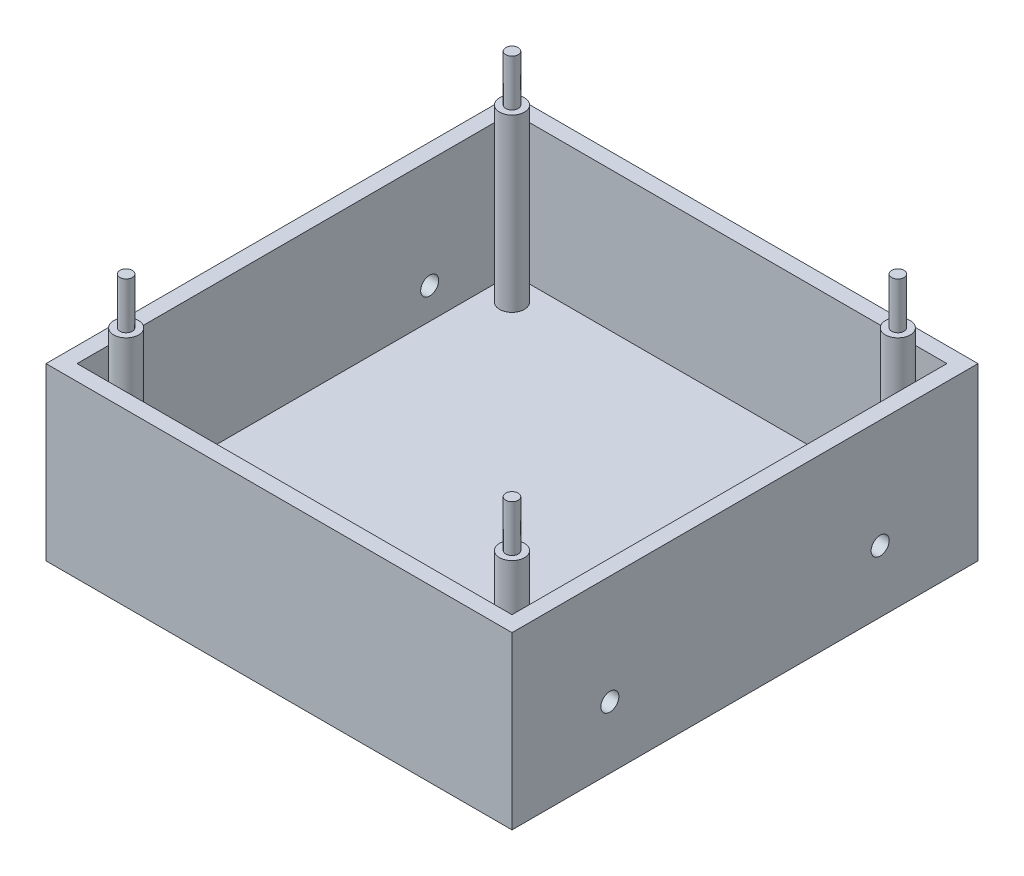
ISO-10303-21;
HEADER;
FILE_DESCRIPTION(('STEP AP214'),'2;1');
FILE_NAME('part.step','',(''),(''),'','','');
FILE_SCHEMA(('AUTOMOTIVE_DESIGN { 1 0 10303 214 1 1 1 1 }'));
ENDSEC;
DATA;
#1=APPLICATION_CONTEXT('core data for automotive mechanical design processes');
#2=APPLICATION_PROTOCOL_DEFINITION('international standard','automotive_design',2000,#1);
#3=PRODUCT_CONTEXT('',#1,'mechanical');
#4=PRODUCT('Part','Part','',(#3));
#5=PRODUCT_RELATED_PRODUCT_CATEGORY('part','',(#4));
#6=PRODUCT_DEFINITION_FORMATION('','',#4);
#7=PRODUCT_DEFINITION_CONTEXT('part definition',#1,'design');
#8=PRODUCT_DEFINITION('design','',#6,#7);
#9=PRODUCT_DEFINITION_SHAPE('','',#8);
#10=(LENGTH_UNIT() NAMED_UNIT(*) SI_UNIT(.MILLI.,.METRE.));
#11=(NAMED_UNIT(*) PLANE_ANGLE_UNIT() SI_UNIT($,.RADIAN.));
#12=(NAMED_UNIT(*) SI_UNIT($,.STERADIAN.) SOLID_ANGLE_UNIT());
#13=UNCERTAINTY_MEASURE_WITH_UNIT(LENGTH_MEASURE(1.E-05),#10,'distance_accuracy_value','');
#14=(GEOMETRIC_REPRESENTATION_CONTEXT(3) GLOBAL_UNCERTAINTY_ASSIGNED_CONTEXT((#13)) GLOBAL_UNIT_ASSIGNED_CONTEXT((#10,
#11,#12)) REPRESENTATION_CONTEXT('',''));
#15=CARTESIAN_POINT('',(0.,0.,0.));
#16=DIRECTION('',(0.,0.,1.));
#17=DIRECTION('',(1.,0.,0.));
#18=AXIS2_PLACEMENT_3D('',#15,#16,#17);
#19=CARTESIAN_POINT('',(0.,55.,4.99999999999999));
#20=DIRECTION('',(0.,0.,-1.));
#21=DIRECTION('',(-1.,0.,0.));
#22=AXIS2_PLACEMENT_3D('',#19,#20,#21);
#23=PLANE('',#22);
#24=DIRECTION('',(0.,-1.,0.));
#25=VECTOR('',#24,1.);
#26=CARTESIAN_POINT('',(4.99999999999998,55.,4.99999999999999));
#27=LINE('',#26,#25);
#28=CARTESIAN_POINT('',(4.99999999999998,55.,4.99999999999999));
#29=VERTEX_POINT('',#28);
#30=CARTESIAN_POINT('',(4.99999999999998,10.,4.99999999999999));
#31=VERTEX_POINT('',#30);
#32=EDGE_CURVE('E113',#29,#31,#27,.T.);
#33=ORIENTED_EDGE('',*,*,#32,.T.);
#34=DIRECTION('',(1.,0.,0.));
#35=VECTOR('',#34,1.);
#36=CARTESIAN_POINT('',(0.,10.,4.99999999999999));
#37=LINE('',#36,#35);
#38=CARTESIAN_POINT('',(145.,10.,4.99999999999999));
#39=VERTEX_POINT('',#38);
#40=EDGE_CURVE('E52',#31,#39,#37,.T.);
#41=ORIENTED_EDGE('',*,*,#40,.T.);
#42=DIRECTION('',(0.,-1.,0.));
#43=VECTOR('',#42,1.);
#44=CARTESIAN_POINT('',(145.,55.,4.99999999999999));
#45=LINE('',#44,#43);
#46=CARTESIAN_POINT('',(145.,55.,4.99999999999999));
#47=VERTEX_POINT('',#46);
#48=EDGE_CURVE('E11',#47,#39,#45,.T.);
#49=ORIENTED_EDGE('',*,*,#48,.F.);
#50=DIRECTION('',(1.,0.,0.));
#51=VECTOR('',#50,1.);
#52=CARTESIAN_POINT('',(0.,55.,4.99999999999999));
#53=LINE('',#52,#51);
#54=EDGE_CURVE('E137',#29,#47,#53,.T.);
#55=ORIENTED_EDGE('',*,*,#54,.F.);
#56=EDGE_LOOP('',(#33,#41,#49,#55));
#57=FACE_BOUND('',#56,.T.);
#58=ADVANCED_FACE('F35',(#57),#23,.F.);
#59=CARTESIAN_POINT('',(145.,55.,0.));
#60=DIRECTION('',(1.,0.,0.));
#61=DIRECTION('',(0.,0.,-1.));
#62=AXIS2_PLACEMENT_3D('',#59,#60,#61);
#63=PLANE('',#62);
#64=CARTESIAN_POINT('',(145.,20.,31.5));
#65=DIRECTION('',(1.,0.,0.));
#66=DIRECTION('',(0.,0.,-1.));
#67=AXIS2_PLACEMENT_3D('',#64,#65,#66);
#68=CIRCLE('',#67,2.9);
#69=CARTESIAN_POINT('',(145.,20.,28.6));
#70=VERTEX_POINT('',#69);
#71=EDGE_CURVE('E186',#70,#70,#68,.F.);
#72=ORIENTED_EDGE('',*,*,#71,.F.);
#73=EDGE_LOOP('',(#72));
#74=FACE_BOUND('',#73,.T.);
#75=CARTESIAN_POINT('',(145.,20.,118.5));
#76=DIRECTION('',(1.,0.,0.));
#77=DIRECTION('',(0.,0.,-1.));
#78=AXIS2_PLACEMENT_3D('',#75,#76,#77);
#79=CIRCLE('',#78,2.9);
#80=CARTESIAN_POINT('',(145.,20.,115.6));
#81=VERTEX_POINT('',#80);
#82=EDGE_CURVE('E171',#81,#81,#79,.F.);
#83=ORIENTED_EDGE('',*,*,#82,.F.);
#84=EDGE_LOOP('',(#83));
#85=FACE_BOUND('',#84,.T.);
#86=ORIENTED_EDGE('',*,*,#48,.T.);
#87=DIRECTION('',(0.,0.,1.));
#88=VECTOR('',#87,1.);
#89=CARTESIAN_POINT('',(145.,10.,0.));
#90=LINE('',#89,#88);
#91=CARTESIAN_POINT('',(145.,10.,145.));
#92=VERTEX_POINT('',#91);
#93=EDGE_CURVE('E58',#39,#92,#90,.T.);
#94=ORIENTED_EDGE('',*,*,#93,.T.);
#95=DIRECTION('',(0.,-1.,0.));
#96=VECTOR('',#95,1.);
#97=CARTESIAN_POINT('',(145.,55.,145.));
#98=LINE('',#97,#96);
#99=CARTESIAN_POINT('',(145.,55.,145.));
#100=VERTEX_POINT('',#99);
#101=EDGE_CURVE('E44',#100,#92,#98,.T.);
#102=ORIENTED_EDGE('',*,*,#101,.F.);
#103=DIRECTION('',(0.,0.,1.));
#104=VECTOR('',#103,1.);
#105=CARTESIAN_POINT('',(145.,55.,0.));
#106=LINE('',#105,#104);
#107=EDGE_CURVE('E140',#47,#100,#106,.T.);
#108=ORIENTED_EDGE('',*,*,#107,.F.);
#109=EDGE_LOOP('',(#86,#94,#102,#108));
#110=FACE_BOUND('',#109,.T.);
#111=ADVANCED_FACE('F258',(#74,#85,#110),#63,.F.);
#112=CARTESIAN_POINT('',(0.,55.,145.));
#113=DIRECTION('',(0.,0.,-1.));
#114=DIRECTION('',(-1.,0.,0.));
#115=AXIS2_PLACEMENT_3D('',#112,#113,#114);
#116=PLANE('',#115);
#117=DIRECTION('',(1.,0.,0.));
#118=VECTOR('',#117,1.);
#119=CARTESIAN_POINT('',(0.,10.,145.));
#120=LINE('',#119,#118);
#121=CARTESIAN_POINT('',(4.99999999999999,10.,145.));
#122=VERTEX_POINT('',#121);
#123=EDGE_CURVE('E116',#122,#92,#120,.T.);
#124=ORIENTED_EDGE('',*,*,#123,.F.);
#125=DIRECTION('',(0.,-1.,0.));
#126=VECTOR('',#125,1.);
#127=CARTESIAN_POINT('',(4.99999999999999,55.,145.));
#128=LINE('',#127,#126);
#129=CARTESIAN_POINT('',(4.99999999999999,55.,145.));
#130=VERTEX_POINT('',#129);
#131=EDGE_CURVE('E103',#130,#122,#128,.T.);
#132=ORIENTED_EDGE('',*,*,#131,.F.);
#133=DIRECTION('',(1.,0.,0.));
#134=VECTOR('',#133,1.);
#135=CARTESIAN_POINT('',(0.,55.,145.));
#136=LINE('',#135,#134);
#137=EDGE_CURVE('E142',#130,#100,#136,.T.);
#138=ORIENTED_EDGE('',*,*,#137,.T.);
#139=ORIENTED_EDGE('',*,*,#101,.T.);
#140=EDGE_LOOP('',(#124,#132,#138,#139));
#141=FACE_BOUND('',#140,.T.);
#142=ADVANCED_FACE('F117',(#141),#116,.T.);
#143=CARTESIAN_POINT('',(150.,55.,0.));
#144=DIRECTION('',(1.,0.,0.));
#145=DIRECTION('',(0.,0.,-1.));
#146=AXIS2_PLACEMENT_3D('',#143,#144,#145);
#147=PLANE('',#146);
#148=CARTESIAN_POINT('',(150.,20.,31.5));
#149=DIRECTION('',(1.,0.,0.));
#150=DIRECTION('',(0.,0.,-1.));
#151=AXIS2_PLACEMENT_3D('',#148,#149,#150);
#152=CIRCLE('',#151,2.9);
#153=CARTESIAN_POINT('',(150.,20.,28.6));
#154=VERTEX_POINT('',#153);
#155=EDGE_CURVE('E167',#154,#154,#152,.T.);
#156=ORIENTED_EDGE('',*,*,#155,.F.);
#157=EDGE_LOOP('',(#156));
#158=FACE_BOUND('',#157,.T.);
#159=CARTESIAN_POINT('',(150.,20.,118.5));
#160=DIRECTION('',(1.,0.,0.));
#161=DIRECTION('',(0.,0.,-1.));
#162=AXIS2_PLACEMENT_3D('',#159,#160,#161);
#163=CIRCLE('',#162,2.9);
#164=CARTESIAN_POINT('',(150.,20.,115.6));
#165=VERTEX_POINT('',#164);
#166=EDGE_CURVE('E174',#165,#165,#163,.T.);
#167=ORIENTED_EDGE('',*,*,#166,.F.);
#168=EDGE_LOOP('',(#167));
#169=FACE_BOUND('',#168,.T.);
#170=DIRECTION('',(0.,0.,1.));
#171=VECTOR('',#170,1.);
#172=CARTESIAN_POINT('',(150.,0.,0.));
#173=LINE('',#172,#171);
#174=CARTESIAN_POINT('',(150.,0.,0.));
#175=VERTEX_POINT('',#174);
#176=CARTESIAN_POINT('',(150.,0.,150.));
#177=VERTEX_POINT('',#176);
#178=EDGE_CURVE('E119',#175,#177,#173,.T.);
#179=ORIENTED_EDGE('',*,*,#178,.F.);
#180=DIRECTION('',(0.,-1.,0.));
#181=VECTOR('',#180,1.);
#182=CARTESIAN_POINT('',(150.,55.,0.));
#183=LINE('',#182,#181);
#184=CARTESIAN_POINT('',(150.,55.,0.));
#185=VERTEX_POINT('',#184);
#186=EDGE_CURVE('E155',#185,#175,#183,.T.);
#187=ORIENTED_EDGE('',*,*,#186,.F.);
#188=DIRECTION('',(0.,0.,1.));
#189=VECTOR('',#188,1.);
#190=CARTESIAN_POINT('',(150.,55.,0.));
#191=LINE('',#190,#189);
#192=CARTESIAN_POINT('',(150.,55.,150.));
#193=VERTEX_POINT('',#192);
#194=EDGE_CURVE('E126',#185,#193,#191,.T.);
#195=ORIENTED_EDGE('',*,*,#194,.T.);
#196=DIRECTION('',(0.,-1.,0.));
#197=VECTOR('',#196,1.);
#198=CARTESIAN_POINT('',(150.,55.,150.));
#199=LINE('',#198,#197);
#200=EDGE_CURVE('E145',#193,#177,#199,.T.);
#201=ORIENTED_EDGE('',*,*,#200,.T.);
#202=EDGE_LOOP('',(#179,#187,#195,#201));
#203=FACE_BOUND('',#202,.T.);
#204=ADVANCED_FACE('F37',(#158,#169,#203),#147,.T.);
#205=CARTESIAN_POINT('',(0.,55.,0.));
#206=DIRECTION('',(0.,0.,-1.));
#207=DIRECTION('',(-1.,0.,0.));
#208=AXIS2_PLACEMENT_3D('',#205,#206,#207);
#209=PLANE('',#208);
#210=DIRECTION('',(1.,0.,0.));
#211=VECTOR('',#210,1.);
#212=CARTESIAN_POINT('',(0.,0.,0.));
#213=LINE('',#212,#211);
#214=CARTESIAN_POINT('',(0.,0.,0.));
#215=VERTEX_POINT('',#214);
#216=EDGE_CURVE('E148',#215,#175,#213,.T.);
#217=ORIENTED_EDGE('',*,*,#216,.F.);
#218=DIRECTION('',(0.,-1.,0.));
#219=VECTOR('',#218,1.);
#220=CARTESIAN_POINT('',(0.,55.,0.));
#221=LINE('',#220,#219);
#222=CARTESIAN_POINT('',(0.,55.,0.));
#223=VERTEX_POINT('',#222);
#224=EDGE_CURVE('E162',#223,#215,#221,.T.);
#225=ORIENTED_EDGE('',*,*,#224,.F.);
#226=DIRECTION('',(1.,0.,0.));
#227=VECTOR('',#226,1.);
#228=CARTESIAN_POINT('',(0.,55.,0.));
#229=LINE('',#228,#227);
#230=EDGE_CURVE('E129',#223,#185,#229,.T.);
#231=ORIENTED_EDGE('',*,*,#230,.T.);
#232=ORIENTED_EDGE('',*,*,#186,.T.);
#233=EDGE_LOOP('',(#217,#225,#231,#232));
#234=FACE_BOUND('',#233,.T.);
#235=ADVANCED_FACE('F273',(#234),#209,.T.);
#236=CARTESIAN_POINT('',(0.,55.,0.));
#237=DIRECTION('',(1.,0.,0.));
#238=DIRECTION('',(0.,0.,-1.));
#239=AXIS2_PLACEMENT_3D('',#236,#237,#238);
#240=PLANE('',#239);
#241=CARTESIAN_POINT('',(0.,20.,31.5));
#242=DIRECTION('',(1.,0.,0.));
#243=DIRECTION('',(0.,0.,-1.));
#244=AXIS2_PLACEMENT_3D('',#241,#242,#243);
#245=CIRCLE('',#244,2.9);
#246=CARTESIAN_POINT('',(0.,20.,28.6));
#247=VERTEX_POINT('',#246);
#248=EDGE_CURVE('E183',#247,#247,#245,.F.);
#249=ORIENTED_EDGE('',*,*,#248,.F.);
#250=EDGE_LOOP('',(#249));
#251=FACE_BOUND('',#250,.T.);
#252=CARTESIAN_POINT('',(0.,20.,118.5));
#253=DIRECTION('',(1.,0.,0.));
#254=DIRECTION('',(0.,0.,-1.));
#255=AXIS2_PLACEMENT_3D('',#252,#253,#254);
#256=CIRCLE('',#255,2.9);
#257=CARTESIAN_POINT('',(0.,20.,115.6));
#258=VERTEX_POINT('',#257);
#259=EDGE_CURVE('E166',#258,#258,#256,.F.);
#260=ORIENTED_EDGE('',*,*,#259,.F.);
#261=EDGE_LOOP('',(#260));
#262=FACE_BOUND('',#261,.T.);
#263=DIRECTION('',(0.,0.,1.));
#264=VECTOR('',#263,1.);
#265=CARTESIAN_POINT('',(0.,0.,0.));
#266=LINE('',#265,#264);
#267=CARTESIAN_POINT('',(0.,0.,150.));
#268=VERTEX_POINT('',#267);
#269=EDGE_CURVE('E151',#215,#268,#266,.T.);
#270=ORIENTED_EDGE('',*,*,#269,.T.);
#271=DIRECTION('',(0.,-1.,0.));
#272=VECTOR('',#271,1.);
#273=CARTESIAN_POINT('',(0.,55.,150.));
#274=LINE('',#273,#272);
#275=CARTESIAN_POINT('',(0.,55.,150.));
#276=VERTEX_POINT('',#275);
#277=EDGE_CURVE('E159',#276,#268,#274,.T.);
#278=ORIENTED_EDGE('',*,*,#277,.F.);
#279=DIRECTION('',(0.,0.,1.));
#280=VECTOR('',#279,1.);
#281=CARTESIAN_POINT('',(0.,55.,0.));
#282=LINE('',#281,#280);
#283=EDGE_CURVE('E133',#223,#276,#282,.T.);
#284=ORIENTED_EDGE('',*,*,#283,.F.);
#285=ORIENTED_EDGE('',*,*,#224,.T.);
#286=EDGE_LOOP('',(#270,#278,#284,#285));
#287=FACE_BOUND('',#286,.T.);
#288=ADVANCED_FACE('F270',(#251,#262,#287),#240,.F.);
#289=CARTESIAN_POINT('',(0.,55.,150.));
#290=DIRECTION('',(0.,0.,-1.));
#291=DIRECTION('',(-1.,0.,0.));
#292=AXIS2_PLACEMENT_3D('',#289,#290,#291);
#293=PLANE('',#292);
#294=DIRECTION('',(1.,0.,0.));
#295=VECTOR('',#294,1.);
#296=CARTESIAN_POINT('',(0.,0.,150.));
#297=LINE('',#296,#295);
#298=EDGE_CURVE('E130',#268,#177,#297,.T.);
#299=ORIENTED_EDGE('',*,*,#298,.T.);
#300=ORIENTED_EDGE('',*,*,#200,.F.);
#301=DIRECTION('',(1.,0.,0.));
#302=VECTOR('',#301,1.);
#303=CARTESIAN_POINT('',(0.,55.,150.));
#304=LINE('',#303,#302);
#305=EDGE_CURVE('E135',#276,#193,#304,.T.);
#306=ORIENTED_EDGE('',*,*,#305,.F.);
#307=ORIENTED_EDGE('',*,*,#277,.T.);
#308=EDGE_LOOP('',(#299,#300,#306,#307));
#309=FACE_BOUND('',#308,.T.);
#310=ADVANCED_FACE('F267',(#309),#293,.F.);
#311=CARTESIAN_POINT('',(4.99999999999998,55.,0.));
#312=DIRECTION('',(1.,0.,0.));
#313=DIRECTION('',(0.,0.,-1.));
#314=AXIS2_PLACEMENT_3D('',#311,#312,#313);
#315=PLANE('',#314);
#316=CARTESIAN_POINT('',(4.99999999999998,20.,31.5));
#317=DIRECTION('',(1.,0.,0.));
#318=DIRECTION('',(0.,0.,-1.));
#319=AXIS2_PLACEMENT_3D('',#316,#317,#318);
#320=CIRCLE('',#319,2.9);
#321=CARTESIAN_POINT('',(4.99999999999998,20.,28.6));
#322=VERTEX_POINT('',#321);
#323=EDGE_CURVE('E39',#322,#322,#320,.F.);
#324=ORIENTED_EDGE('',*,*,#323,.T.);
#325=EDGE_LOOP('',(#324));
#326=FACE_BOUND('',#325,.T.);
#327=CARTESIAN_POINT('',(5.,20.,118.5));
#328=DIRECTION('',(1.,0.,0.));
#329=DIRECTION('',(0.,0.,-1.));
#330=AXIS2_PLACEMENT_3D('',#327,#328,#329);
#331=CIRCLE('',#330,2.9);
#332=CARTESIAN_POINT('',(5.,20.,115.6));
#333=VERTEX_POINT('',#332);
#334=EDGE_CURVE('E164',#333,#333,#331,.F.);
#335=ORIENTED_EDGE('',*,*,#334,.T.);
#336=EDGE_LOOP('',(#335));
#337=FACE_BOUND('',#336,.T.);
#338=DIRECTION('',(0.,0.,1.));
#339=VECTOR('',#338,1.);
#340=CARTESIAN_POINT('',(4.99999999999998,10.,0.));
#341=LINE('',#340,#339);
#342=EDGE_CURVE('E107',#31,#122,#341,.T.);
#343=ORIENTED_EDGE('',*,*,#342,.F.);
#344=ORIENTED_EDGE('',*,*,#32,.F.);
#345=DIRECTION('',(0.,0.,1.));
#346=VECTOR('',#345,1.);
#347=CARTESIAN_POINT('',(4.99999999999998,55.,0.));
#348=LINE('',#347,#346);
#349=EDGE_CURVE('E109',#29,#130,#348,.T.);
#350=ORIENTED_EDGE('',*,*,#349,.T.);
#351=ORIENTED_EDGE('',*,*,#131,.T.);
#352=EDGE_LOOP('',(#343,#344,#350,#351));
#353=FACE_BOUND('',#352,.T.);
#354=ADVANCED_FACE('F105',(#326,#337,#353),#315,.T.);
#355=CARTESIAN_POINT('',(0.,55.,0.));
#356=DIRECTION('',(0.,1.,0.));
#357=DIRECTION('',(0.,0.,1.));
#358=AXIS2_PLACEMENT_3D('',#355,#356,#357);
#359=PLANE('',#358);
#360=ORIENTED_EDGE('',*,*,#194,.F.);
#361=ORIENTED_EDGE('',*,*,#230,.F.);
#362=ORIENTED_EDGE('',*,*,#283,.T.);
#363=ORIENTED_EDGE('',*,*,#305,.T.);
#364=EDGE_LOOP('',(#360,#361,#362,#363));
#365=FACE_BOUND('',#364,.T.);
#366=ORIENTED_EDGE('',*,*,#54,.T.);
#367=ORIENTED_EDGE('',*,*,#107,.T.);
#368=ORIENTED_EDGE('',*,*,#137,.F.);
#369=ORIENTED_EDGE('',*,*,#349,.F.);
#370=EDGE_LOOP('',(#366,#367,#368,#369));
#371=FACE_BOUND('',#370,.T.);
#372=ADVANCED_FACE('F251',(#365,#371),#359,.T.);
#373=CARTESIAN_POINT('',(0.,0.,0.));
#374=DIRECTION('',(0.,1.,0.));
#375=DIRECTION('',(0.,0.,1.));
#376=AXIS2_PLACEMENT_3D('',#373,#374,#375);
#377=PLANE('',#376);
#378=ORIENTED_EDGE('',*,*,#178,.T.);
#379=ORIENTED_EDGE('',*,*,#298,.F.);
#380=ORIENTED_EDGE('',*,*,#269,.F.);
#381=ORIENTED_EDGE('',*,*,#216,.T.);
#382=EDGE_LOOP('',(#378,#379,#380,#381));
#383=FACE_BOUND('',#382,.T.);
#384=ADVANCED_FACE('F242',(#383),#377,.F.);
#385=CARTESIAN_POINT('',(0.,10.,0.));
#386=DIRECTION('',(0.,1.,0.));
#387=DIRECTION('',(0.,0.,1.));
#388=AXIS2_PLACEMENT_3D('',#385,#386,#387);
#389=PLANE('',#388);
#390=CARTESIAN_POINT('',(12.9,10.,137.1));
#391=DIRECTION('',(0.,1.,0.));
#392=DIRECTION('',(0.,0.,1.));
#393=AXIS2_PLACEMENT_3D('',#390,#391,#392);
#394=CIRCLE('',#393,4.00000000000036);
#395=CARTESIAN_POINT('',(12.9,10.,141.1));
#396=VERTEX_POINT('',#395);
#397=EDGE_CURVE('E225',#396,#396,#394,.T.);
#398=ORIENTED_EDGE('',*,*,#397,.F.);
#399=EDGE_LOOP('',(#398));
#400=FACE_BOUND('',#399,.T.);
#401=CARTESIAN_POINT('',(137.100000000001,10.,137.099999999999));
#402=DIRECTION('',(0.,1.,0.));
#403=DIRECTION('',(0.,0.,1.));
#404=AXIS2_PLACEMENT_3D('',#401,#402,#403);
#405=CIRCLE('',#404,3.99999999999999);
#406=CARTESIAN_POINT('',(137.100000000001,10.,141.099999999999));
#407=VERTEX_POINT('',#406);
#408=EDGE_CURVE('E228',#407,#407,#405,.T.);
#409=ORIENTED_EDGE('',*,*,#408,.F.);
#410=EDGE_LOOP('',(#409));
#411=FACE_BOUND('',#410,.T.);
#412=CARTESIAN_POINT('',(137.100000000002,10.,12.8999999999982));
#413=DIRECTION('',(0.,1.,0.));
#414=DIRECTION('',(0.,0.,1.));
#415=AXIS2_PLACEMENT_3D('',#412,#413,#414);
#416=CIRCLE('',#415,3.99999999999983);
#417=CARTESIAN_POINT('',(137.100000000002,10.,16.8999999999981));
#418=VERTEX_POINT('',#417);
#419=EDGE_CURVE('E231',#418,#418,#416,.T.);
#420=ORIENTED_EDGE('',*,*,#419,.F.);
#421=EDGE_LOOP('',(#420));
#422=FACE_BOUND('',#421,.T.);
#423=CARTESIAN_POINT('',(12.9,10.,12.9));
#424=DIRECTION('',(0.,1.,0.));
#425=DIRECTION('',(0.,0.,1.));
#426=AXIS2_PLACEMENT_3D('',#423,#424,#425);
#427=CIRCLE('',#426,4.);
#428=CARTESIAN_POINT('',(12.9,10.,16.9));
#429=VERTEX_POINT('',#428);
#430=EDGE_CURVE('E234',#429,#429,#427,.T.);
#431=ORIENTED_EDGE('',*,*,#430,.F.);
#432=EDGE_LOOP('',(#431));
#433=FACE_BOUND('',#432,.T.);
#434=ORIENTED_EDGE('',*,*,#93,.F.);
#435=ORIENTED_EDGE('',*,*,#40,.F.);
#436=ORIENTED_EDGE('',*,*,#342,.T.);
#437=ORIENTED_EDGE('',*,*,#123,.T.);
#438=EDGE_LOOP('',(#434,#435,#436,#437));
#439=FACE_BOUND('',#438,.T.);
#440=ADVANCED_FACE('F121',(#400,#411,#422,#433,#439),#389,.T.);
#441=CARTESIAN_POINT('',(12.9,65.,12.9));
#442=DIRECTION('',(0.,-1.,0.));
#443=DIRECTION('',(0.,0.,-1.));
#444=AXIS2_PLACEMENT_3D('',#441,#442,#443);
#445=CYLINDRICAL_SURFACE('',#444,4.);
#446=ORIENTED_EDGE('',*,*,#430,.T.);
#447=EDGE_LOOP('',(#446));
#448=FACE_BOUND('',#447,.T.);
#449=CARTESIAN_POINT('',(12.9,65.,12.9));
#450=DIRECTION('',(0.,1.,0.));
#451=DIRECTION('',(0.,0.,1.));
#452=AXIS2_PLACEMENT_3D('',#449,#450,#451);
#453=CIRCLE('',#452,4.);
#454=CARTESIAN_POINT('',(12.9,65.,16.9));
#455=VERTEX_POINT('',#454);
#456=EDGE_CURVE('E222',#455,#455,#453,.T.);
#457=ORIENTED_EDGE('',*,*,#456,.F.);
#458=EDGE_LOOP('',(#457));
#459=FACE_BOUND('',#458,.T.);
#460=ADVANCED_FACE('F238',(#448,#459),#445,.T.);
#461=CARTESIAN_POINT('',(0.,65.,0.));
#462=DIRECTION('',(0.,1.,0.));
#463=DIRECTION('',(0.,0.,1.));
#464=AXIS2_PLACEMENT_3D('',#461,#462,#463);
#465=PLANE('',#464);
#466=CARTESIAN_POINT('',(12.9,65.,12.9));
#467=DIRECTION('',(0.,1.,0.));
#468=DIRECTION('',(0.,0.,1.));
#469=AXIS2_PLACEMENT_3D('',#466,#467,#468);
#470=CIRCLE('',#469,2.);
#471=CARTESIAN_POINT('',(12.9,65.,14.9));
#472=VERTEX_POINT('',#471);
#473=EDGE_CURVE('E219',#472,#472,#470,.T.);
#474=ORIENTED_EDGE('',*,*,#473,.F.);
#475=EDGE_LOOP('',(#474));
#476=FACE_BOUND('',#475,.T.);
#477=ORIENTED_EDGE('',*,*,#456,.T.);
#478=EDGE_LOOP('',(#477));
#479=FACE_BOUND('',#478,.T.);
#480=ADVANCED_FACE('F249',(#476,#479),#465,.T.);
#481=CARTESIAN_POINT('',(137.100000000002,65.,12.8999999999982));
#482=DIRECTION('',(0.,-1.,0.));
#483=DIRECTION('',(0.,0.,-1.));
#484=AXIS2_PLACEMENT_3D('',#481,#482,#483);
#485=CYLINDRICAL_SURFACE('',#484,3.99999999999983);
#486=ORIENTED_EDGE('',*,*,#419,.T.);
#487=EDGE_LOOP('',(#486));
#488=FACE_BOUND('',#487,.T.);
#489=CARTESIAN_POINT('',(137.100000000002,65.,12.8999999999982));
#490=DIRECTION('',(0.,1.,0.));
#491=DIRECTION('',(0.,0.,1.));
#492=AXIS2_PLACEMENT_3D('',#489,#490,#491);
#493=CIRCLE('',#492,3.99999999999983);
#494=CARTESIAN_POINT('',(137.100000000002,65.,16.8999999999981));
#495=VERTEX_POINT('',#494);
#496=EDGE_CURVE('E216',#495,#495,#493,.T.);
#497=ORIENTED_EDGE('',*,*,#496,.F.);
#498=EDGE_LOOP('',(#497));
#499=FACE_BOUND('',#498,.T.);
#500=ADVANCED_FACE('F424',(#488,#499),#485,.T.);
#501=CARTESIAN_POINT('',(0.,65.,0.));
#502=DIRECTION('',(0.,1.,0.));
#503=DIRECTION('',(0.,0.,1.));
#504=AXIS2_PLACEMENT_3D('',#501,#502,#503);
#505=PLANE('',#504);
#506=CARTESIAN_POINT('',(137.100000000002,65.,12.8999999999982));
#507=DIRECTION('',(0.,1.,0.));
#508=DIRECTION('',(0.,0.,1.));
#509=AXIS2_PLACEMENT_3D('',#506,#507,#508);
#510=CIRCLE('',#509,1.99999999999983);
#511=CARTESIAN_POINT('',(137.100000000002,65.,14.8999999999981));
#512=VERTEX_POINT('',#511);
#513=EDGE_CURVE('E213',#512,#512,#510,.T.);
#514=ORIENTED_EDGE('',*,*,#513,.F.);
#515=EDGE_LOOP('',(#514));
#516=FACE_BOUND('',#515,.T.);
#517=ORIENTED_EDGE('',*,*,#496,.T.);
#518=EDGE_LOOP('',(#517));
#519=FACE_BOUND('',#518,.T.);
#520=ADVANCED_FACE('F420',(#516,#519),#505,.T.);
#521=CARTESIAN_POINT('',(137.100000000001,65.,137.099999999999));
#522=DIRECTION('',(0.,-1.,0.));
#523=DIRECTION('',(0.,0.,-1.));
#524=AXIS2_PLACEMENT_3D('',#521,#522,#523);
#525=CYLINDRICAL_SURFACE('',#524,3.99999999999999);
#526=ORIENTED_EDGE('',*,*,#408,.T.);
#527=EDGE_LOOP('',(#526));
#528=FACE_BOUND('',#527,.T.);
#529=CARTESIAN_POINT('',(137.100000000001,65.,137.099999999999));
#530=DIRECTION('',(0.,1.,0.));
#531=DIRECTION('',(0.,0.,1.));
#532=AXIS2_PLACEMENT_3D('',#529,#530,#531);
#533=CIRCLE('',#532,3.99999999999999);
#534=CARTESIAN_POINT('',(137.100000000001,65.,141.099999999999));
#535=VERTEX_POINT('',#534);
#536=EDGE_CURVE('E210',#535,#535,#533,.T.);
#537=ORIENTED_EDGE('',*,*,#536,.F.);
#538=EDGE_LOOP('',(#537));
#539=FACE_BOUND('',#538,.T.);
#540=ADVANCED_FACE('F416',(#528,#539),#525,.T.);
#541=CARTESIAN_POINT('',(0.,65.,0.));
#542=DIRECTION('',(0.,1.,0.));
#543=DIRECTION('',(0.,0.,1.));
#544=AXIS2_PLACEMENT_3D('',#541,#542,#543);
#545=PLANE('',#544);
#546=CARTESIAN_POINT('',(137.100000000001,65.,137.099999999999));
#547=DIRECTION('',(0.,1.,0.));
#548=DIRECTION('',(0.,0.,1.));
#549=AXIS2_PLACEMENT_3D('',#546,#547,#548);
#550=CIRCLE('',#549,1.99999999999999);
#551=CARTESIAN_POINT('',(137.100000000001,65.,139.099999999999));
#552=VERTEX_POINT('',#551);
#553=EDGE_CURVE('E207',#552,#552,#550,.T.);
#554=ORIENTED_EDGE('',*,*,#553,.F.);
#555=EDGE_LOOP('',(#554));
#556=FACE_BOUND('',#555,.T.);
#557=ORIENTED_EDGE('',*,*,#536,.T.);
#558=EDGE_LOOP('',(#557));
#559=FACE_BOUND('',#558,.T.);
#560=ADVANCED_FACE('F412',(#556,#559),#545,.T.);
#561=CARTESIAN_POINT('',(12.9,65.,137.1));
#562=DIRECTION('',(0.,-1.,0.));
#563=DIRECTION('',(0.,0.,-1.));
#564=AXIS2_PLACEMENT_3D('',#561,#562,#563);
#565=CYLINDRICAL_SURFACE('',#564,4.00000000000036);
#566=ORIENTED_EDGE('',*,*,#397,.T.);
#567=EDGE_LOOP('',(#566));
#568=FACE_BOUND('',#567,.T.);
#569=CARTESIAN_POINT('',(12.9,65.,137.1));
#570=DIRECTION('',(0.,1.,0.));
#571=DIRECTION('',(0.,0.,1.));
#572=AXIS2_PLACEMENT_3D('',#569,#570,#571);
#573=CIRCLE('',#572,4.00000000000036);
#574=CARTESIAN_POINT('',(12.9,65.,141.1));
#575=VERTEX_POINT('',#574);
#576=EDGE_CURVE('E204',#575,#575,#573,.T.);
#577=ORIENTED_EDGE('',*,*,#576,.F.);
#578=EDGE_LOOP('',(#577));
#579=FACE_BOUND('',#578,.T.);
#580=ADVANCED_FACE('F408',(#568,#579),#565,.T.);
#581=CARTESIAN_POINT('',(0.,65.,0.));
#582=DIRECTION('',(0.,1.,0.));
#583=DIRECTION('',(0.,0.,1.));
#584=AXIS2_PLACEMENT_3D('',#581,#582,#583);
#585=PLANE('',#584);
#586=CARTESIAN_POINT('',(12.9,65.,137.1));
#587=DIRECTION('',(0.,1.,0.));
#588=DIRECTION('',(0.,0.,1.));
#589=AXIS2_PLACEMENT_3D('',#586,#587,#588);
#590=CIRCLE('',#589,2.00000000000037);
#591=CARTESIAN_POINT('',(12.9,65.,139.1));
#592=VERTEX_POINT('',#591);
#593=EDGE_CURVE('E201',#592,#592,#590,.T.);
#594=ORIENTED_EDGE('',*,*,#593,.F.);
#595=EDGE_LOOP('',(#594));
#596=FACE_BOUND('',#595,.T.);
#597=ORIENTED_EDGE('',*,*,#576,.T.);
#598=EDGE_LOOP('',(#597));
#599=FACE_BOUND('',#598,.T.);
#600=ADVANCED_FACE('F401',(#596,#599),#585,.T.);
#601=CARTESIAN_POINT('',(0.,80.,0.));
#602=DIRECTION('',(0.,1.,0.));
#603=DIRECTION('',(0.,0.,1.));
#604=AXIS2_PLACEMENT_3D('',#601,#602,#603);
#605=PLANE('',#604);
#606=CARTESIAN_POINT('',(12.9,80.,137.1));
#607=DIRECTION('',(0.,1.,0.));
#608=DIRECTION('',(0.,0.,1.));
#609=AXIS2_PLACEMENT_3D('',#606,#607,#608);
#610=CIRCLE('',#609,2.00000000000037);
#611=CARTESIAN_POINT('',(12.9,80.,139.1));
#612=VERTEX_POINT('',#611);
#613=EDGE_CURVE('E198',#612,#612,#610,.T.);
#614=ORIENTED_EDGE('',*,*,#613,.T.);
#615=EDGE_LOOP('',(#614));
#616=FACE_BOUND('',#615,.T.);
#617=ADVANCED_FACE('F398',(#616),#605,.T.);
#618=CARTESIAN_POINT('',(12.9,80.,137.1));
#619=DIRECTION('',(0.,-1.,0.));
#620=DIRECTION('',(0.,0.,-1.));
#621=AXIS2_PLACEMENT_3D('',#618,#619,#620);
#622=CYLINDRICAL_SURFACE('',#621,2.00000000000037);
#623=ORIENTED_EDGE('',*,*,#593,.T.);
#624=EDGE_LOOP('',(#623));
#625=FACE_BOUND('',#624,.T.);
#626=ORIENTED_EDGE('',*,*,#613,.F.);
#627=EDGE_LOOP('',(#626));
#628=FACE_BOUND('',#627,.T.);
#629=ADVANCED_FACE('F393',(#625,#628),#622,.T.);
#630=CARTESIAN_POINT('',(0.,80.,0.));
#631=DIRECTION('',(0.,1.,0.));
#632=DIRECTION('',(0.,0.,1.));
#633=AXIS2_PLACEMENT_3D('',#630,#631,#632);
#634=PLANE('',#633);
#635=CARTESIAN_POINT('',(137.100000000001,80.,137.099999999999));
#636=DIRECTION('',(0.,1.,0.));
#637=DIRECTION('',(0.,0.,1.));
#638=AXIS2_PLACEMENT_3D('',#635,#636,#637);
#639=CIRCLE('',#638,1.99999999999999);
#640=CARTESIAN_POINT('',(137.100000000001,80.,139.099999999999));
#641=VERTEX_POINT('',#640);
#642=EDGE_CURVE('E195',#641,#641,#639,.T.);
#643=ORIENTED_EDGE('',*,*,#642,.T.);
#644=EDGE_LOOP('',(#643));
#645=FACE_BOUND('',#644,.T.);
#646=ADVANCED_FACE('F390',(#645),#634,.T.);
#647=CARTESIAN_POINT('',(137.100000000001,80.,137.099999999999));
#648=DIRECTION('',(0.,-1.,0.));
#649=DIRECTION('',(0.,0.,-1.));
#650=AXIS2_PLACEMENT_3D('',#647,#648,#649);
#651=CYLINDRICAL_SURFACE('',#650,1.99999999999999);
#652=ORIENTED_EDGE('',*,*,#553,.T.);
#653=EDGE_LOOP('',(#652));
#654=FACE_BOUND('',#653,.T.);
#655=ORIENTED_EDGE('',*,*,#642,.F.);
#656=EDGE_LOOP('',(#655));
#657=FACE_BOUND('',#656,.T.);
#658=ADVANCED_FACE('F385',(#654,#657),#651,.T.);
#659=CARTESIAN_POINT('',(0.,80.,0.));
#660=DIRECTION('',(0.,1.,0.));
#661=DIRECTION('',(0.,0.,1.));
#662=AXIS2_PLACEMENT_3D('',#659,#660,#661);
#663=PLANE('',#662);
#664=CARTESIAN_POINT('',(137.100000000002,80.,12.8999999999982));
#665=DIRECTION('',(0.,1.,0.));
#666=DIRECTION('',(0.,0.,1.));
#667=AXIS2_PLACEMENT_3D('',#664,#665,#666);
#668=CIRCLE('',#667,1.99999999999983);
#669=CARTESIAN_POINT('',(137.100000000002,80.,14.8999999999981));
#670=VERTEX_POINT('',#669);
#671=EDGE_CURVE('E192',#670,#670,#668,.T.);
#672=ORIENTED_EDGE('',*,*,#671,.T.);
#673=EDGE_LOOP('',(#672));
#674=FACE_BOUND('',#673,.T.);
#675=ADVANCED_FACE('F382',(#674),#663,.T.);
#676=CARTESIAN_POINT('',(137.100000000002,80.,12.8999999999982));
#677=DIRECTION('',(0.,-1.,0.));
#678=DIRECTION('',(0.,0.,-1.));
#679=AXIS2_PLACEMENT_3D('',#676,#677,#678);
#680=CYLINDRICAL_SURFACE('',#679,1.99999999999983);
#681=ORIENTED_EDGE('',*,*,#513,.T.);
#682=EDGE_LOOP('',(#681));
#683=FACE_BOUND('',#682,.T.);
#684=ORIENTED_EDGE('',*,*,#671,.F.);
#685=EDGE_LOOP('',(#684));
#686=FACE_BOUND('',#685,.T.);
#687=ADVANCED_FACE('F378',(#683,#686),#680,.T.);
#688=CARTESIAN_POINT('',(0.,80.,0.));
#689=DIRECTION('',(0.,1.,0.));
#690=DIRECTION('',(0.,0.,1.));
#691=AXIS2_PLACEMENT_3D('',#688,#689,#690);
#692=PLANE('',#691);
#693=CARTESIAN_POINT('',(12.9,80.,12.9));
#694=DIRECTION('',(0.,1.,0.));
#695=DIRECTION('',(0.,0.,1.));
#696=AXIS2_PLACEMENT_3D('',#693,#694,#695);
#697=CIRCLE('',#696,2.);
#698=CARTESIAN_POINT('',(12.9,80.,14.9));
#699=VERTEX_POINT('',#698);
#700=EDGE_CURVE('E189',#699,#699,#697,.T.);
#701=ORIENTED_EDGE('',*,*,#700,.T.);
#702=EDGE_LOOP('',(#701));
#703=FACE_BOUND('',#702,.T.);
#704=ADVANCED_FACE('F375',(#703),#692,.T.);
#705=CARTESIAN_POINT('',(12.9,80.,12.9));
#706=DIRECTION('',(0.,-1.,0.));
#707=DIRECTION('',(0.,0.,-1.));
#708=AXIS2_PLACEMENT_3D('',#705,#706,#707);
#709=CYLINDRICAL_SURFACE('',#708,2.);
#710=ORIENTED_EDGE('',*,*,#473,.T.);
#711=EDGE_LOOP('',(#710));
#712=FACE_BOUND('',#711,.T.);
#713=ORIENTED_EDGE('',*,*,#700,.F.);
#714=EDGE_LOOP('',(#713));
#715=FACE_BOUND('',#714,.T.);
#716=ADVANCED_FACE('F340',(#712,#715),#709,.T.);
#717=CARTESIAN_POINT('',(150.,20.,118.5));
#718=DIRECTION('',(-1.,0.,0.));
#719=DIRECTION('',(0.,0.,1.));
#720=AXIS2_PLACEMENT_3D('',#717,#718,#719);
#721=CYLINDRICAL_SURFACE('',#720,2.9);
#722=ORIENTED_EDGE('',*,*,#334,.F.);
#723=EDGE_LOOP('',(#722));
#724=FACE_BOUND('',#723,.T.);
#725=ORIENTED_EDGE('',*,*,#259,.T.);
#726=EDGE_LOOP('',(#725));
#727=FACE_BOUND('',#726,.T.);
#728=ADVANCED_FACE('F334',(#724,#727),#721,.F.);
#729=CARTESIAN_POINT('',(150.,20.,31.5));
#730=DIRECTION('',(-1.,0.,0.));
#731=DIRECTION('',(0.,0.,1.));
#732=AXIS2_PLACEMENT_3D('',#729,#730,#731);
#733=CYLINDRICAL_SURFACE('',#732,2.9);
#734=ORIENTED_EDGE('',*,*,#323,.F.);
#735=EDGE_LOOP('',(#734));
#736=FACE_BOUND('',#735,.T.);
#737=ORIENTED_EDGE('',*,*,#248,.T.);
#738=EDGE_LOOP('',(#737));
#739=FACE_BOUND('',#738,.T.);
#740=ADVANCED_FACE('F339',(#736,#739),#733,.F.);
#741=ORIENTED_EDGE('',*,*,#166,.T.);
#742=EDGE_LOOP('',(#741));
#743=FACE_BOUND('',#742,.T.);
#744=ORIENTED_EDGE('',*,*,#82,.T.);
#745=EDGE_LOOP('',(#744));
#746=FACE_BOUND('',#745,.T.);
#747=ADVANCED_FACE('F343',(#743,#746),#721,.F.);
#748=ORIENTED_EDGE('',*,*,#155,.T.);
#749=EDGE_LOOP('',(#748));
#750=FACE_BOUND('',#749,.T.);
#751=ORIENTED_EDGE('',*,*,#71,.T.);
#752=EDGE_LOOP('',(#751));
#753=FACE_BOUND('',#752,.T.);
#754=ADVANCED_FACE('F355',(#750,#753),#733,.F.);
#755=CLOSED_SHELL('',(#58,#111,#142,#204,#235,#288,#310,#354,#372,#384,#440,#460,#480,#500,#520,
#540,#560,#580,#600,#617,#629,#646,#658,#675,#687,#704,#716,#728,#740,#747,#754));
#756=MANIFOLD_SOLID_BREP('B2',#755);
#757=ADVANCED_BREP_SHAPE_REPRESENTATION('',(#18,#756),#14);
#758=SHAPE_DEFINITION_REPRESENTATION(#9,#757);
ENDSEC;
END-ISO-10303-21;
